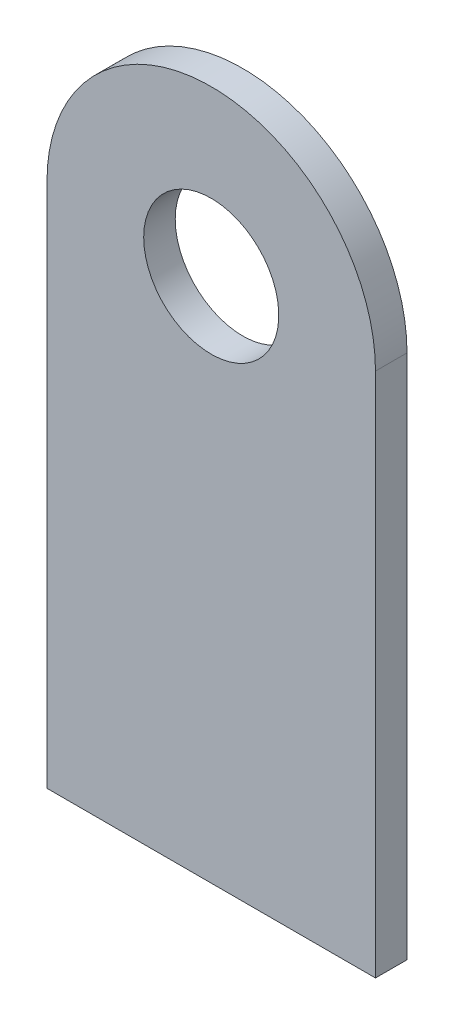
ISO-10303-21;
HEADER;
FILE_DESCRIPTION(('STEP AP214'),'2;1');
FILE_NAME('part.step','',(''),(''),'','','');
FILE_SCHEMA(('AUTOMOTIVE_DESIGN { 1 0 10303 214 1 1 1 1 }'));
ENDSEC;
DATA;
#1=APPLICATION_CONTEXT('core data for automotive mechanical design processes');
#2=APPLICATION_PROTOCOL_DEFINITION('international standard','automotive_design',2000,#1);
#3=PRODUCT_CONTEXT('',#1,'mechanical');
#4=PRODUCT('Part','Part','',(#3));
#5=PRODUCT_RELATED_PRODUCT_CATEGORY('part','',(#4));
#6=PRODUCT_DEFINITION_FORMATION('','',#4);
#7=PRODUCT_DEFINITION_CONTEXT('part definition',#1,'design');
#8=PRODUCT_DEFINITION('design','',#6,#7);
#9=PRODUCT_DEFINITION_SHAPE('','',#8);
#10=(LENGTH_UNIT() NAMED_UNIT(*) SI_UNIT(.MILLI.,.METRE.));
#11=(NAMED_UNIT(*) PLANE_ANGLE_UNIT() SI_UNIT($,.RADIAN.));
#12=(NAMED_UNIT(*) SI_UNIT($,.STERADIAN.) SOLID_ANGLE_UNIT());
#13=UNCERTAINTY_MEASURE_WITH_UNIT(LENGTH_MEASURE(1.E-05),#10,'distance_accuracy_value','');
#14=(GEOMETRIC_REPRESENTATION_CONTEXT(3) GLOBAL_UNCERTAINTY_ASSIGNED_CONTEXT((#13)) GLOBAL_UNIT_ASSIGNED_CONTEXT((#10,
#11,#12)) REPRESENTATION_CONTEXT('',''));
#15=CARTESIAN_POINT('',(0.,0.,0.));
#16=DIRECTION('',(0.,0.,1.));
#17=DIRECTION('',(1.,0.,0.));
#18=AXIS2_PLACEMENT_3D('',#15,#16,#17);
#19=CARTESIAN_POINT('',(7.9375,25.4,1.524));
#20=DIRECTION('',(0.,0.,-1.));
#21=DIRECTION('',(-1.,0.,0.));
#22=AXIS2_PLACEMENT_3D('',#19,#20,#21);
#23=PLANE('',#22);
#24=DIRECTION('',(1.,0.,0.));
#25=VECTOR('',#24,1.);
#26=CARTESIAN_POINT('',(15.875,0.,1.524));
#27=LINE('',#26,#25);
#28=CARTESIAN_POINT('',(0.,0.,1.524));
#29=VERTEX_POINT('',#28);
#30=CARTESIAN_POINT('',(15.875,0.,1.524));
#31=VERTEX_POINT('',#30);
#32=EDGE_CURVE('E98',#29,#31,#27,.T.);
#33=ORIENTED_EDGE('',*,*,#32,.T.);
#34=DIRECTION('',(0.,1.,0.));
#35=VECTOR('',#34,1.);
#36=CARTESIAN_POINT('',(15.875,25.4,1.524));
#37=LINE('',#36,#35);
#38=CARTESIAN_POINT('',(15.875,25.4,1.524));
#39=VERTEX_POINT('',#38);
#40=EDGE_CURVE('E93',#31,#39,#37,.T.);
#41=ORIENTED_EDGE('',*,*,#40,.T.);
#42=CARTESIAN_POINT('',(7.9375,25.4,1.524));
#43=DIRECTION('',(0.,0.,1.));
#44=DIRECTION('',(-1.,0.,0.));
#45=AXIS2_PLACEMENT_3D('',#42,#43,#44);
#46=CIRCLE('',#45,7.9375);
#47=CARTESIAN_POINT('',(0.,25.4,1.524));
#48=VERTEX_POINT('',#47);
#49=EDGE_CURVE('E96',#39,#48,#46,.T.);
#50=ORIENTED_EDGE('',*,*,#49,.T.);
#51=DIRECTION('',(0.,-1.,0.));
#52=VECTOR('',#51,1.);
#53=CARTESIAN_POINT('',(0.,0.,1.524));
#54=LINE('',#53,#52);
#55=EDGE_CURVE('E63',#48,#29,#54,.T.);
#56=ORIENTED_EDGE('',*,*,#55,.T.);
#57=EDGE_LOOP('',(#33,#41,#50,#56));
#58=FACE_BOUND('',#57,.T.);
#59=CARTESIAN_POINT('',(7.9375,25.4,1.524));
#60=DIRECTION('',(0.,0.,1.));
#61=DIRECTION('',(1.,0.,0.));
#62=AXIS2_PLACEMENT_3D('',#59,#60,#61);
#63=CIRCLE('',#62,3.2639);
#64=CARTESIAN_POINT('',(4.6736,25.4,1.524));
#65=VERTEX_POINT('',#64);
#66=EDGE_CURVE('E118',#65,#65,#63,.T.);
#67=ORIENTED_EDGE('',*,*,#66,.F.);
#68=EDGE_LOOP('',(#67));
#69=FACE_BOUND('',#68,.T.);
#70=ADVANCED_FACE('F45',(#58,#69),#23,.F.);
#71=CARTESIAN_POINT('',(7.9375,25.4,0.));
#72=DIRECTION('',(0.,0.,-1.));
#73=DIRECTION('',(-1.,0.,0.));
#74=AXIS2_PLACEMENT_3D('',#71,#72,#73);
#75=PLANE('',#74);
#76=DIRECTION('',(1.,0.,0.));
#77=VECTOR('',#76,1.);
#78=CARTESIAN_POINT('',(15.875,0.,0.));
#79=LINE('',#78,#77);
#80=CARTESIAN_POINT('',(0.,0.,0.));
#81=VERTEX_POINT('',#80);
#82=CARTESIAN_POINT('',(15.875,0.,0.));
#83=VERTEX_POINT('',#82);
#84=EDGE_CURVE('E114',#81,#83,#79,.T.);
#85=ORIENTED_EDGE('',*,*,#84,.F.);
#86=DIRECTION('',(0.,-1.,0.));
#87=VECTOR('',#86,1.);
#88=CARTESIAN_POINT('',(0.,0.,0.));
#89=LINE('',#88,#87);
#90=CARTESIAN_POINT('',(0.,25.4,0.));
#91=VERTEX_POINT('',#90);
#92=EDGE_CURVE('E86',#91,#81,#89,.T.);
#93=ORIENTED_EDGE('',*,*,#92,.F.);
#94=CARTESIAN_POINT('',(7.9375,25.4,0.));
#95=DIRECTION('',(0.,0.,1.));
#96=DIRECTION('',(-1.,0.,0.));
#97=AXIS2_PLACEMENT_3D('',#94,#95,#96);
#98=CIRCLE('',#97,7.9375);
#99=CARTESIAN_POINT('',(15.875,25.4,0.));
#100=VERTEX_POINT('',#99);
#101=EDGE_CURVE('E80',#100,#91,#98,.T.);
#102=ORIENTED_EDGE('',*,*,#101,.F.);
#103=DIRECTION('',(0.,1.,0.));
#104=VECTOR('',#103,1.);
#105=CARTESIAN_POINT('',(15.875,25.4,0.));
#106=LINE('',#105,#104);
#107=EDGE_CURVE('E103',#83,#100,#106,.T.);
#108=ORIENTED_EDGE('',*,*,#107,.F.);
#109=EDGE_LOOP('',(#85,#93,#102,#108));
#110=FACE_BOUND('',#109,.T.);
#111=CARTESIAN_POINT('',(7.9375,25.4,0.));
#112=DIRECTION('',(0.,0.,1.));
#113=DIRECTION('',(1.,0.,0.));
#114=AXIS2_PLACEMENT_3D('',#111,#112,#113);
#115=CIRCLE('',#114,3.2639);
#116=CARTESIAN_POINT('',(4.6736,25.4,0.));
#117=VERTEX_POINT('',#116);
#118=EDGE_CURVE('E136',#117,#117,#115,.T.);
#119=ORIENTED_EDGE('',*,*,#118,.T.);
#120=EDGE_LOOP('',(#119));
#121=FACE_BOUND('',#120,.T.);
#122=ADVANCED_FACE('F131',(#110,#121),#75,.T.);
#123=CARTESIAN_POINT('',(15.875,0.,1.524));
#124=DIRECTION('',(0.,1.,0.));
#125=DIRECTION('',(-1.,0.,0.));
#126=AXIS2_PLACEMENT_3D('',#123,#124,#125);
#127=PLANE('',#126);
#128=ORIENTED_EDGE('',*,*,#84,.T.);
#129=DIRECTION('',(0.,0.,-1.));
#130=VECTOR('',#129,1.);
#131=CARTESIAN_POINT('',(15.875,0.,1.524));
#132=LINE('',#131,#130);
#133=EDGE_CURVE('E11',#31,#83,#132,.T.);
#134=ORIENTED_EDGE('',*,*,#133,.F.);
#135=ORIENTED_EDGE('',*,*,#32,.F.);
#136=DIRECTION('',(0.,0.,-1.));
#137=VECTOR('',#136,1.);
#138=CARTESIAN_POINT('',(0.,0.,1.524));
#139=LINE('',#138,#137);
#140=EDGE_CURVE('E110',#29,#81,#139,.T.);
#141=ORIENTED_EDGE('',*,*,#140,.T.);
#142=EDGE_LOOP('',(#128,#134,#135,#141));
#143=FACE_BOUND('',#142,.T.);
#144=ADVANCED_FACE('F47',(#143),#127,.F.);
#145=CARTESIAN_POINT('',(15.875,25.4,1.524));
#146=DIRECTION('',(-1.,0.,0.));
#147=DIRECTION('',(0.,-1.,0.));
#148=AXIS2_PLACEMENT_3D('',#145,#146,#147);
#149=PLANE('',#148);
#150=ORIENTED_EDGE('',*,*,#107,.T.);
#151=DIRECTION('',(0.,0.,-1.));
#152=VECTOR('',#151,1.);
#153=CARTESIAN_POINT('',(15.875,25.4,1.524));
#154=LINE('',#153,#152);
#155=EDGE_CURVE('E55',#39,#100,#154,.T.);
#156=ORIENTED_EDGE('',*,*,#155,.F.);
#157=ORIENTED_EDGE('',*,*,#40,.F.);
#158=ORIENTED_EDGE('',*,*,#133,.T.);
#159=EDGE_LOOP('',(#150,#156,#157,#158));
#160=FACE_BOUND('',#159,.T.);
#161=ADVANCED_FACE('F102',(#160),#149,.F.);
#162=CARTESIAN_POINT('',(7.9375,25.4,1.524));
#163=DIRECTION('',(0.,0.,-1.));
#164=DIRECTION('',(-1.,0.,0.));
#165=AXIS2_PLACEMENT_3D('',#162,#163,#164);
#166=CYLINDRICAL_SURFACE('',#165,7.9375);
#167=ORIENTED_EDGE('',*,*,#101,.T.);
#168=DIRECTION('',(0.,0.,-1.));
#169=VECTOR('',#168,1.);
#170=CARTESIAN_POINT('',(0.,25.4,1.524));
#171=LINE('',#170,#169);
#172=EDGE_CURVE('E105',#48,#91,#171,.T.);
#173=ORIENTED_EDGE('',*,*,#172,.F.);
#174=ORIENTED_EDGE('',*,*,#49,.F.);
#175=ORIENTED_EDGE('',*,*,#155,.T.);
#176=EDGE_LOOP('',(#167,#173,#174,#175));
#177=FACE_BOUND('',#176,.T.);
#178=ADVANCED_FACE('F106',(#177),#166,.T.);
#179=CARTESIAN_POINT('',(0.,0.,1.524));
#180=DIRECTION('',(1.,0.,0.));
#181=DIRECTION('',(0.,0.,-1.));
#182=AXIS2_PLACEMENT_3D('',#179,#180,#181);
#183=PLANE('',#182);
#184=ORIENTED_EDGE('',*,*,#92,.T.);
#185=ORIENTED_EDGE('',*,*,#140,.F.);
#186=ORIENTED_EDGE('',*,*,#55,.F.);
#187=ORIENTED_EDGE('',*,*,#172,.T.);
#188=EDGE_LOOP('',(#184,#185,#186,#187));
#189=FACE_BOUND('',#188,.T.);
#190=ADVANCED_FACE('F128',(#189),#183,.F.);
#191=CARTESIAN_POINT('',(7.9375,25.4,1.524));
#192=DIRECTION('',(0.,0.,-1.));
#193=DIRECTION('',(-1.,0.,0.));
#194=AXIS2_PLACEMENT_3D('',#191,#192,#193);
#195=CYLINDRICAL_SURFACE('',#194,3.2639);
#196=CARTESIAN_POINT('',(4.6736,25.4,1.524));
#197=CARTESIAN_POINT('',(4.6736,25.4,1.508125));
#198=CARTESIAN_POINT('',(4.6736,25.4,1.49225));
#199=CARTESIAN_POINT('',(4.6736,25.4,1.4605));
#200=CARTESIAN_POINT('',(4.6736,25.4,1.444625));
#201=CARTESIAN_POINT('',(4.6736,25.4,1.412875));
#202=CARTESIAN_POINT('',(4.6736,25.4,1.397));
#203=CARTESIAN_POINT('',(4.6736,25.4,1.36525));
#204=CARTESIAN_POINT('',(4.6736,25.4,1.349375));
#205=CARTESIAN_POINT('',(4.6736,25.4,1.317625));
#206=CARTESIAN_POINT('',(4.6736,25.4,1.30175));
#207=CARTESIAN_POINT('',(4.6736,25.4,1.27));
#208=CARTESIAN_POINT('',(4.6736,25.4,1.254125));
#209=CARTESIAN_POINT('',(4.6736,25.4,1.222375));
#210=CARTESIAN_POINT('',(4.6736,25.4,1.2065));
#211=CARTESIAN_POINT('',(4.6736,25.4,1.17475));
#212=CARTESIAN_POINT('',(4.6736,25.4,1.158875));
#213=CARTESIAN_POINT('',(4.6736,25.4,1.127125));
#214=CARTESIAN_POINT('',(4.6736,25.4,1.11125));
#215=CARTESIAN_POINT('',(4.6736,25.4,1.0795));
#216=CARTESIAN_POINT('',(4.6736,25.4,1.063625));
#217=CARTESIAN_POINT('',(4.6736,25.4,1.031875));
#218=CARTESIAN_POINT('',(4.6736,25.4,1.016));
#219=CARTESIAN_POINT('',(4.6736,25.4,0.98425));
#220=CARTESIAN_POINT('',(4.6736,25.4,0.968375));
#221=CARTESIAN_POINT('',(4.6736,25.4,0.936625));
#222=CARTESIAN_POINT('',(4.6736,25.4,0.92075));
#223=CARTESIAN_POINT('',(4.6736,25.4,0.889));
#224=CARTESIAN_POINT('',(4.6736,25.4,0.873125));
#225=CARTESIAN_POINT('',(4.6736,25.4,0.841375));
#226=CARTESIAN_POINT('',(4.6736,25.4,0.8255));
#227=CARTESIAN_POINT('',(4.6736,25.4,0.79375));
#228=CARTESIAN_POINT('',(4.6736,25.4,0.777875));
#229=CARTESIAN_POINT('',(4.6736,25.4,0.746125));
#230=CARTESIAN_POINT('',(4.6736,25.4,0.73025));
#231=CARTESIAN_POINT('',(4.6736,25.4,0.6985));
#232=CARTESIAN_POINT('',(4.6736,25.4,0.682625));
#233=CARTESIAN_POINT('',(4.6736,25.4,0.650875));
#234=CARTESIAN_POINT('',(4.6736,25.4,0.635));
#235=CARTESIAN_POINT('',(4.6736,25.4,0.60325));
#236=CARTESIAN_POINT('',(4.6736,25.4,0.587375));
#237=CARTESIAN_POINT('',(4.6736,25.4,0.555625));
#238=CARTESIAN_POINT('',(4.6736,25.4,0.53975));
#239=CARTESIAN_POINT('',(4.6736,25.4,0.508));
#240=CARTESIAN_POINT('',(4.6736,25.4,0.492125));
#241=CARTESIAN_POINT('',(4.6736,25.4,0.460375));
#242=CARTESIAN_POINT('',(4.6736,25.4,0.4445));
#243=CARTESIAN_POINT('',(4.6736,25.4,0.41275));
#244=CARTESIAN_POINT('',(4.6736,25.4,0.396875));
#245=CARTESIAN_POINT('',(4.6736,25.4,0.365125));
#246=CARTESIAN_POINT('',(4.6736,25.4,0.34925));
#247=CARTESIAN_POINT('',(4.6736,25.4,0.3175));
#248=CARTESIAN_POINT('',(4.6736,25.4,0.301625));
#249=CARTESIAN_POINT('',(4.6736,25.4,0.269875));
#250=CARTESIAN_POINT('',(4.6736,25.4,0.254));
#251=CARTESIAN_POINT('',(4.6736,25.4,0.22225));
#252=CARTESIAN_POINT('',(4.6736,25.4,0.206375));
#253=CARTESIAN_POINT('',(4.6736,25.4,0.174625));
#254=CARTESIAN_POINT('',(4.6736,25.4,0.15875));
#255=CARTESIAN_POINT('',(4.6736,25.4,0.127));
#256=CARTESIAN_POINT('',(4.6736,25.4,0.111125));
#257=CARTESIAN_POINT('',(4.6736,25.4,0.079375));
#258=CARTESIAN_POINT('',(4.6736,25.4,0.0635));
#259=CARTESIAN_POINT('',(4.6736,25.4,0.0317499999999999));
#260=CARTESIAN_POINT('',(4.6736,25.4,0.015875));
#261=CARTESIAN_POINT('',(4.6736,25.4,0.));
#262=B_SPLINE_CURVE_WITH_KNOTS('',3,(#196,#197,#198,#199,#200,#201,#202,#203,#204,#205,#206,
#207,#208,#209,#210,#211,#212,#213,#214,#215,#216,#217,#218,#219,#220,#221,#222,#223,#224,#225,
#226,#227,#228,#229,#230,#231,#232,#233,#234,#235,#236,#237,#238,#239,#240,#241,#242,#243,#244,
#245,#246,#247,#248,#249,#250,#251,#252,#253,#254,#255,#256,#257,#258,#259,#260,#261),
.UNSPECIFIED.,.F.,.F.,(4,2,2,2,2,2,2,2,2,2,2,2,2,2,2,2,2,2,2,2,2,2,2,2,2,2,2,2,2,2,2,2,4),(0.,
0.0476250000000001,0.0952500000000001,0.142875,0.1905,0.238125,0.28575,0.333375,0.381,0.428625,
0.47625,0.523875,0.5715,0.619125,0.66675,0.714375,0.762,0.809625,0.85725,0.904875,0.9525,
1.000125,1.04775,1.095375,1.143,1.190625,1.23825,1.285875,1.3335,1.381125,1.42875,1.476375,
1.524),.UNSPECIFIED.);
#263=EDGE_CURVE('BSEAM144',#65,#117,#262,.T.);
#264=ORIENTED_EDGE('',*,*,#66,.T.);
#265=ORIENTED_EDGE('',*,*,#118,.F.);
#266=ORIENTED_EDGE('',*,*,#263,.T.);
#267=ORIENTED_EDGE('',*,*,#263,.F.);
#268=EDGE_LOOP('',(#264,#266,#265,#267));
#269=FACE_BOUND('',#268,.T.);
#270=ADVANCED_FACE('F144',(#269),#195,.F.);
#271=CLOSED_SHELL('',(#70,#122,#144,#161,#178,#190,#270));
#272=MANIFOLD_SOLID_BREP('B2',#271);
#273=ADVANCED_BREP_SHAPE_REPRESENTATION('',(#18,#272),#14);
#274=SHAPE_DEFINITION_REPRESENTATION(#9,#273);
ENDSEC;
END-ISO-10303-21;
